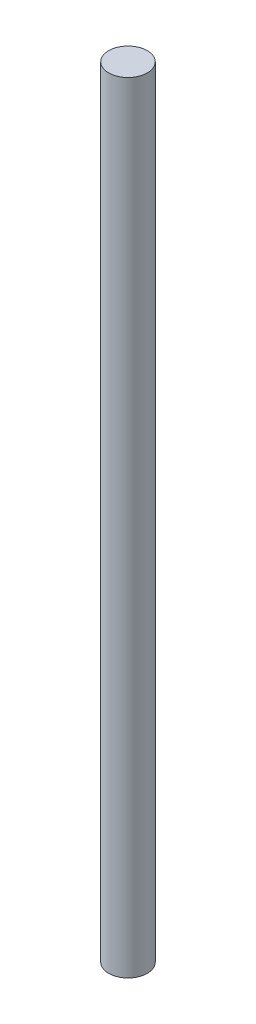
ISO-10303-21;
HEADER;
FILE_DESCRIPTION(('STEP AP214'),'2;1');
FILE_NAME('part.step','',(''),(''),'','','');
FILE_SCHEMA(('AUTOMOTIVE_DESIGN { 1 0 10303 214 1 1 1 1 }'));
ENDSEC;
DATA;
#1=APPLICATION_CONTEXT('core data for automotive mechanical design processes');
#2=APPLICATION_PROTOCOL_DEFINITION('international standard','automotive_design',2000,#1);
#3=PRODUCT_CONTEXT('',#1,'mechanical');
#4=PRODUCT('Part','Part','',(#3));
#5=PRODUCT_RELATED_PRODUCT_CATEGORY('part','',(#4));
#6=PRODUCT_DEFINITION_FORMATION('','',#4);
#7=PRODUCT_DEFINITION_CONTEXT('part definition',#1,'design');
#8=PRODUCT_DEFINITION('design','',#6,#7);
#9=PRODUCT_DEFINITION_SHAPE('','',#8);
#10=(LENGTH_UNIT() NAMED_UNIT(*) SI_UNIT(.MILLI.,.METRE.));
#11=(NAMED_UNIT(*) PLANE_ANGLE_UNIT() SI_UNIT($,.RADIAN.));
#12=(NAMED_UNIT(*) SI_UNIT($,.STERADIAN.) SOLID_ANGLE_UNIT());
#13=UNCERTAINTY_MEASURE_WITH_UNIT(LENGTH_MEASURE(1.E-05),#10,'distance_accuracy_value','');
#14=(GEOMETRIC_REPRESENTATION_CONTEXT(3) GLOBAL_UNCERTAINTY_ASSIGNED_CONTEXT((#13)) GLOBAL_UNIT_ASSIGNED_CONTEXT((#10,
#11,#12)) REPRESENTATION_CONTEXT('',''));
#15=CARTESIAN_POINT('',(0.,0.,0.));
#16=DIRECTION('',(0.,0.,1.));
#17=DIRECTION('',(1.,0.,0.));
#18=AXIS2_PLACEMENT_3D('',#15,#16,#17);
#19=CARTESIAN_POINT('',(0.,303.,0.));
#20=DIRECTION('',(0.,-1.,0.));
#21=DIRECTION('',(0.,0.,-1.));
#22=AXIS2_PLACEMENT_3D('',#19,#20,#21);
#23=CYLINDRICAL_SURFACE('',#22,7.5);
#24=CARTESIAN_POINT('',(0.,303.,0.));
#25=DIRECTION('',(0.,1.,0.));
#26=DIRECTION('',(0.,0.,1.));
#27=AXIS2_PLACEMENT_3D('',#24,#25,#26);
#28=CIRCLE('',#27,7.5);
#29=CARTESIAN_POINT('',(0.,303.,7.5));
#30=VERTEX_POINT('',#29);
#31=EDGE_CURVE('E10',#30,#30,#28,.T.);
#32=ORIENTED_EDGE('',*,*,#31,.F.);
#33=EDGE_LOOP('',(#32));
#34=FACE_BOUND('',#33,.T.);
#35=CARTESIAN_POINT('',(0.,0.,0.));
#36=DIRECTION('',(0.,1.,0.));
#37=DIRECTION('',(0.,0.,1.));
#38=AXIS2_PLACEMENT_3D('',#35,#36,#37);
#39=CIRCLE('',#38,7.5);
#40=CARTESIAN_POINT('',(0.,0.,7.5));
#41=VERTEX_POINT('',#40);
#42=EDGE_CURVE('E33',#41,#41,#39,.T.);
#43=ORIENTED_EDGE('',*,*,#42,.T.);
#44=EDGE_LOOP('',(#43));
#45=FACE_BOUND('',#44,.T.);
#46=ADVANCED_FACE('F30',(#34,#45),#23,.T.);
#47=CARTESIAN_POINT('',(0.,303.,0.));
#48=DIRECTION('',(0.,1.,0.));
#49=DIRECTION('',(0.,0.,1.));
#50=AXIS2_PLACEMENT_3D('',#47,#48,#49);
#51=PLANE('',#50);
#52=ORIENTED_EDGE('',*,*,#31,.T.);
#53=EDGE_LOOP('',(#52));
#54=FACE_BOUND('',#53,.T.);
#55=ADVANCED_FACE('F45',(#54),#51,.T.);
#56=CARTESIAN_POINT('',(0.,0.,0.));
#57=DIRECTION('',(0.,1.,0.));
#58=DIRECTION('',(0.,0.,1.));
#59=AXIS2_PLACEMENT_3D('',#56,#57,#58);
#60=PLANE('',#59);
#61=ORIENTED_EDGE('',*,*,#42,.F.);
#62=EDGE_LOOP('',(#61));
#63=FACE_BOUND('',#62,.T.);
#64=ADVANCED_FACE('F43',(#63),#60,.F.);
#65=CLOSED_SHELL('',(#46,#55,#64));
#66=MANIFOLD_SOLID_BREP('B2',#65);
#67=ADVANCED_BREP_SHAPE_REPRESENTATION('',(#18,#66),#14);
#68=SHAPE_DEFINITION_REPRESENTATION(#9,#67);
ENDSEC;
END-ISO-10303-21;
